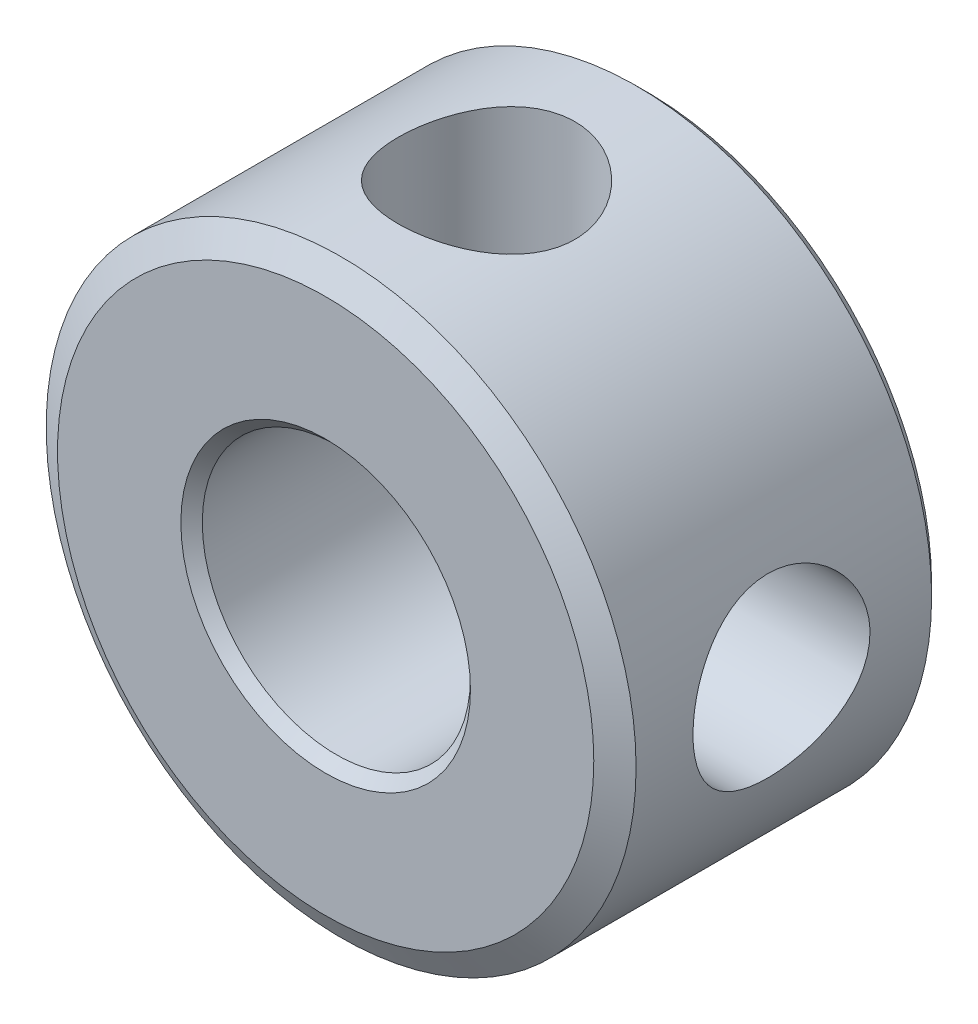
ISO-10303-21;
HEADER;
FILE_DESCRIPTION(('STEP AP214'),'2;1');
FILE_NAME('part.step','',(''),(''),'','','');
FILE_SCHEMA(('AUTOMOTIVE_DESIGN { 1 0 10303 214 1 1 1 1 }'));
ENDSEC;
DATA;
#1=APPLICATION_CONTEXT('core data for automotive mechanical design processes');
#2=APPLICATION_PROTOCOL_DEFINITION('international standard','automotive_design',2000,#1);
#3=PRODUCT_CONTEXT('',#1,'mechanical');
#4=PRODUCT('Part','Part','',(#3));
#5=PRODUCT_RELATED_PRODUCT_CATEGORY('part','',(#4));
#6=PRODUCT_DEFINITION_FORMATION('','',#4);
#7=PRODUCT_DEFINITION_CONTEXT('part definition',#1,'design');
#8=PRODUCT_DEFINITION('design','',#6,#7);
#9=PRODUCT_DEFINITION_SHAPE('','',#8);
#10=(LENGTH_UNIT() NAMED_UNIT(*) SI_UNIT(.MILLI.,.METRE.));
#11=(NAMED_UNIT(*) PLANE_ANGLE_UNIT() SI_UNIT($,.RADIAN.));
#12=(NAMED_UNIT(*) SI_UNIT($,.STERADIAN.) SOLID_ANGLE_UNIT());
#13=UNCERTAINTY_MEASURE_WITH_UNIT(LENGTH_MEASURE(1.E-05),#10,'distance_accuracy_value','');
#14=(GEOMETRIC_REPRESENTATION_CONTEXT(3) GLOBAL_UNCERTAINTY_ASSIGNED_CONTEXT((#13)) GLOBAL_UNIT_ASSIGNED_CONTEXT((#10,
#11,#12)) REPRESENTATION_CONTEXT('',''));
#15=CARTESIAN_POINT('',(0.,0.,0.));
#16=DIRECTION('',(0.,0.,1.));
#17=DIRECTION('',(1.,0.,0.));
#18=AXIS2_PLACEMENT_3D('',#15,#16,#17);
#19=CARTESIAN_POINT('',(0.,0.,0.));
#20=DIRECTION('',(0.,0.,1.));
#21=DIRECTION('',(1.,0.,0.));
#22=AXIS2_PLACEMENT_3D('',#19,#20,#21);
#23=CYLINDRICAL_SURFACE('',#22,5.5);
#24=CARTESIAN_POINT('',(0.,5.5,-1.35));
#25=CARTESIAN_POINT('',(-0.0905174740286299,5.49999922175605,-1.35000109723338));
#26=CARTESIAN_POINT('',(-0.181046050186682,5.49774407263349,-1.35747324998637));
#27=CARTESIAN_POINT('',(-0.359466937835369,5.4889681615306,-1.38709348964431));
#28=CARTESIAN_POINT('',(-0.447358454852562,5.48244612728661,-1.40924595382568));
#29=CARTESIAN_POINT('',(-0.617905978529979,5.4658510775202,-1.46742061860129));
#30=CARTESIAN_POINT('',(-0.70056950083491,5.45578330275468,-1.50342235658083));
#31=CARTESIAN_POINT('',(-0.858686599158444,5.4331432016141,-1.58818970236142));
#32=CARTESIAN_POINT('',(-0.934139214216635,5.42057054211273,-1.63695700813496));
#33=CARTESIAN_POINT('',(-1.07785897690212,5.39385810912051,-1.74734640821994));
#34=CARTESIAN_POINT('',(-1.14588987836877,5.3796862202274,-1.80926828847451));
#35=CARTESIAN_POINT('',(-1.27077413015656,5.35156417631486,-1.9435701529012));
#36=CARTESIAN_POINT('',(-1.32762559960185,5.33761405896951,-2.01595189333746));
#37=CARTESIAN_POINT('',(-1.42978041496078,5.31117525393149,-2.17111782834137));
#38=CARTESIAN_POINT('',(-1.47479539924435,5.29872647330262,-2.25409930708981));
#39=CARTESIAN_POINT('',(-1.55013534252236,5.27717982433434,-2.42688817965332));
#40=CARTESIAN_POINT('',(-1.5804638291197,5.26808115144642,-2.51669392832077));
#41=CARTESIAN_POINT('',(-1.62471797050917,5.25459957922278,-2.69792929274351));
#42=CARTESIAN_POINT('',(-1.63907915858145,5.25009176256987,-2.78924301825034));
#43=CARTESIAN_POINT('',(-1.65235103676139,5.24593068724744,-2.97308647183844));
#44=CARTESIAN_POINT('',(-1.65126547037186,5.24627625236628,-3.065615899865));
#45=CARTESIAN_POINT('',(-1.63401674919793,5.25167218474556,-3.24572229946933));
#46=CARTESIAN_POINT('',(-1.61839925788954,5.25655227459055,-3.33335747539846));
#47=CARTESIAN_POINT('',(-1.57341162469761,5.27019191851487,-3.50470176490081));
#48=CARTESIAN_POINT('',(-1.54404012555805,5.27895185545586,-3.58841049011177));
#49=CARTESIAN_POINT('',(-1.4719762931905,5.2995000638247,-3.75086038462681));
#50=CARTESIAN_POINT('',(-1.42910698628107,5.31132817727547,-3.82951779235079));
#51=CARTESIAN_POINT('',(-1.33138744847552,5.33666085700071,-3.97870522421121));
#52=CARTESIAN_POINT('',(-1.27653431402847,5.3501658292169,-4.04923327235516));
#53=CARTESIAN_POINT('',(-1.15369419842101,5.37802112427731,-4.18325480983822));
#54=CARTESIAN_POINT('',(-1.08525439821367,5.39238319741548,-4.24633153043264));
#55=CARTESIAN_POINT('',(-0.938589585245362,5.41983468469584,-4.36020938247067));
#56=CARTESIAN_POINT('',(-0.860363957046975,5.43292401870251,-4.41100974125587));
#57=CARTESIAN_POINT('',(-0.695590542177082,5.45647476076417,-4.4991459147112));
#58=CARTESIAN_POINT('',(-0.608990524722744,5.46691798035145,-4.53638926787485));
#59=CARTESIAN_POINT('',(-0.43036995716387,5.48386874015444,-4.59565954910959));
#60=CARTESIAN_POINT('',(-0.338350926748538,5.49037737805699,-4.61769072138574));
#61=CARTESIAN_POINT('',(-0.155047466935164,5.49855201107892,-4.64521739568933));
#62=CARTESIAN_POINT('',(-0.0638551073613046,5.50038335459569,-4.65127774438177));
#63=CARTESIAN_POINT('',(0.118249566405722,5.49948215565936,-4.64827392871671));
#64=CARTESIAN_POINT('',(0.20916191635986,5.49675022245532,-4.63921178338341));
#65=CARTESIAN_POINT('',(0.385993965840668,5.48713766685879,-4.60667692777735));
#66=CARTESIAN_POINT('',(0.471980049875587,5.48035212779358,-4.58353427366104));
#67=CARTESIAN_POINT('',(0.638830102849975,5.46341782625686,-4.52389244394398));
#68=CARTESIAN_POINT('',(0.719693454728143,5.45326865953193,-4.48739166285835));
#69=CARTESIAN_POINT('',(0.876080908407158,5.43036619786457,-4.40112151797076));
#70=CARTESIAN_POINT('',(0.951438208819637,5.41755808912642,-4.35106472495723));
#71=CARTESIAN_POINT('',(1.09287563877816,5.39080815640749,-4.23945277054191));
#72=CARTESIAN_POINT('',(1.15895343559153,5.37686604874188,-4.17789472692356));
#73=CARTESIAN_POINT('',(1.2824431900613,5.34878489056052,-4.04237396079372));
#74=CARTESIAN_POINT('',(1.33945329354654,5.33465707536594,-3.96804193665109));
#75=CARTESIAN_POINT('',(1.44021894579369,5.3083416676231,-3.81055926708511));
#76=CARTESIAN_POINT('',(1.48397484212419,5.29615402420116,-3.72740885298596));
#77=CARTESIAN_POINT('',(1.55669081839885,5.27523908576561,-3.55491425961984));
#78=CARTESIAN_POINT('',(1.58571981630755,5.2664957162821,-3.46560119480975));
#79=CARTESIAN_POINT('',(1.62823903896625,5.25350753799074,-3.28304323417537));
#80=CARTESIAN_POINT('',(1.64173458876657,5.2492611875913,-3.18979969713356));
#81=CARTESIAN_POINT('',(1.65244182933565,5.24589969745695,-3.00620232978615));
#82=CARTESIAN_POINT('',(1.65030860839339,5.2465781218703,-2.91588998388066));
#83=CARTESIAN_POINT('',(1.63138255989295,5.25249341417124,-2.73697448628992));
#84=CARTESIAN_POINT('',(1.61459031937188,5.25773009951806,-2.64837126630601));
#85=CARTESIAN_POINT('',(1.5672457768455,5.27203340037424,-2.47646006094286));
#86=CARTESIAN_POINT('',(1.53686693057775,5.28105165000561,-2.39309998390214));
#87=CARTESIAN_POINT('',(1.46334657833242,5.3018930680005,-2.2325933173005));
#88=CARTESIAN_POINT('',(1.42020262959164,5.31371677313743,-2.15544792059517));
#89=CARTESIAN_POINT('',(1.32053640185579,5.33937444068416,-2.00652057182018));
#90=CARTESIAN_POINT('',(1.26358403702293,5.35326594180177,-1.93503636261355));
#91=CARTESIAN_POINT('',(1.1386917809276,5.38121452495028,-1.80242725186135));
#92=CARTESIAN_POINT('',(1.07074903884795,5.39527164906296,-1.74130504658547));
#93=CARTESIAN_POINT('',(0.923412338401572,5.42246030227714,-1.62937424647547));
#94=CARTESIAN_POINT('',(0.843741674369667,5.43555275742241,-1.57891940845896));
#95=CARTESIAN_POINT('',(0.676655511381881,5.45886748501394,-1.49219131310557));
#96=CARTESIAN_POINT('',(0.589243658298849,5.46909109924173,-1.45591142289804));
#97=CARTESIAN_POINT('',(0.418833483920808,5.48462392466231,-1.40181519678198));
#98=CARTESIAN_POINT('',(0.336365658149657,5.49034230119174,-1.38243715982843));
#99=CARTESIAN_POINT('',(0.169268214753857,5.49803038943942,-1.35653012223427));
#100=CARTESIAN_POINT('',(0.0846389608439533,5.50000072770214,-1.3499989740247));
#101=CARTESIAN_POINT('',(0.,5.5,-1.35));
#102=B_SPLINE_CURVE_WITH_KNOTS('',3,(#24,#25,#26,#27,#28,#29,#30,#31,#32,#33,#34,#35,#36,#37,
#38,#39,#40,#41,#42,#43,#44,#45,#46,#47,#48,#49,#50,#51,#52,#53,#54,#55,#56,#57,#58,#59,#60,#61,
#62,#63,#64,#65,#66,#67,#68,#69,#70,#71,#72,#73,#74,#75,#76,#77,#78,#79,#80,#81,#82,#83,#84,#85,
#86,#87,#88,#89,#90,#91,#92,#93,#94,#95,#96,#97,#98,#99,#100,#101),.UNSPECIFIED.,.T.,.F.,(4,2,2,
2,2,2,2,2,2,2,2,2,2,2,2,2,2,2,2,2,2,2,2,2,2,2,2,2,2,2,2,2,2,2,2,2,2,2,4),(0.,0.271241523973871,
0.542563961330599,0.813487043930961,1.08444618085397,1.36241163243011,1.64042381017496,
1.9246862910452,2.20888045997546,2.48511658292259,2.76128576150998,3.02748618367444,
3.29371288023801,3.56358669091831,3.83352596174411,4.11473814452983,4.39596802184178,
4.67908151569857,4.96211598881688,5.23499690382399,5.50784138905359,5.77452421350559,
6.04123910053101,6.31412436273199,6.5870781020021,6.869944403551,7.15280328677948,
7.43432596446376,7.71575210406311,7.98545171013636,8.25514051627759,8.52148044442993,
8.78787137308417,9.06396618247923,9.34013272387252,9.62437295772337,9.90848002754758,
10.162148611235,10.4157747864376),.UNSPECIFIED.);
#103=CARTESIAN_POINT('',(0.,5.5,-1.35));
#104=VERTEX_POINT('',#103);
#105=EDGE_CURVE('E60',#104,#104,#102,.T.);
#106=ORIENTED_EDGE('',*,*,#105,.T.);
#107=EDGE_LOOP('',(#106));
#108=FACE_BOUND('',#107,.T.);
#109=CARTESIAN_POINT('',(5.5,0.,-1.35));
#110=CARTESIAN_POINT('',(5.49999922175605,0.0905174740286107,-1.35000109723338));
#111=CARTESIAN_POINT('',(5.49774407263349,0.181046050186663,-1.35747324998637));
#112=CARTESIAN_POINT('',(5.4889681615306,0.359466937835349,-1.38709348964431));
#113=CARTESIAN_POINT('',(5.48244612728661,0.447358454852542,-1.40924595382568));
#114=CARTESIAN_POINT('',(5.4658510775202,0.61790597852996,-1.46742061860129));
#115=CARTESIAN_POINT('',(5.45578330275468,0.700569500834891,-1.50342235658083));
#116=CARTESIAN_POINT('',(5.4331432016141,0.858686599158425,-1.58818970236142));
#117=CARTESIAN_POINT('',(5.42057054211274,0.934139214216617,-1.63695700813496));
#118=CARTESIAN_POINT('',(5.39385810912052,1.0778589769021,-1.74734640821994));
#119=CARTESIAN_POINT('',(5.3796862202274,1.14588987836875,-1.80926828847451));
#120=CARTESIAN_POINT('',(5.35156417631487,1.27077413015654,-1.9435701529012));
#121=CARTESIAN_POINT('',(5.33761405896952,1.32762559960183,-2.01595189333746));
#122=CARTESIAN_POINT('',(5.3111752539315,1.42978041496076,-2.17111782834137));
#123=CARTESIAN_POINT('',(5.29872647330263,1.47479539924433,-2.25409930708981));
#124=CARTESIAN_POINT('',(5.27717982433435,1.55013534252234,-2.42688817965332));
#125=CARTESIAN_POINT('',(5.26808115144642,1.58046382911969,-2.51669392832077));
#126=CARTESIAN_POINT('',(5.25459957922278,1.62471797050915,-2.69792929274351));
#127=CARTESIAN_POINT('',(5.25009176256987,1.63907915858143,-2.78924301825034));
#128=CARTESIAN_POINT('',(5.24593068724745,1.65235103676137,-2.97308647183844));
#129=CARTESIAN_POINT('',(5.24627625236629,1.65126547037184,-3.065615899865));
#130=CARTESIAN_POINT('',(5.25167218474556,1.63401674919791,-3.24572229946933));
#131=CARTESIAN_POINT('',(5.25655227459055,1.61839925788952,-3.33335747539846));
#132=CARTESIAN_POINT('',(5.27019191851487,1.57341162469759,-3.50470176490081));
#133=CARTESIAN_POINT('',(5.27895185545586,1.54404012555803,-3.58841049011177));
#134=CARTESIAN_POINT('',(5.29950006382471,1.47197629319048,-3.75086038462681));
#135=CARTESIAN_POINT('',(5.31132817727548,1.42910698628105,-3.82951779235079));
#136=CARTESIAN_POINT('',(5.33666085700071,1.3313874484755,-3.97870522421121));
#137=CARTESIAN_POINT('',(5.35016582921691,1.27653431402845,-4.04923327235516));
#138=CARTESIAN_POINT('',(5.37802112427731,1.15369419842099,-4.18325480983822));
#139=CARTESIAN_POINT('',(5.39238319741548,1.08525439821365,-4.24633153043264));
#140=CARTESIAN_POINT('',(5.41983468469585,0.938589585245343,-4.36020938247067));
#141=CARTESIAN_POINT('',(5.43292401870251,0.860363957046956,-4.41100974125587));
#142=CARTESIAN_POINT('',(5.45647476076418,0.695590542177063,-4.4991459147112));
#143=CARTESIAN_POINT('',(5.46691798035146,0.608990524722725,-4.53638926787485));
#144=CARTESIAN_POINT('',(5.48386874015444,0.430369957163851,-4.59565954910959));
#145=CARTESIAN_POINT('',(5.49037737805699,0.338350926748519,-4.61769072138574));
#146=CARTESIAN_POINT('',(5.49855201107892,0.155047466935144,-4.64521739568933));
#147=CARTESIAN_POINT('',(5.50038335459569,0.0638551073612853,-4.65127774438177));
#148=CARTESIAN_POINT('',(5.49948215565935,-0.118249566405742,-4.64827392871671));
#149=CARTESIAN_POINT('',(5.49675022245532,-0.209161916359879,-4.63921178338341));
#150=CARTESIAN_POINT('',(5.48713766685879,-0.385993965840687,-4.60667692777735));
#151=CARTESIAN_POINT('',(5.48035212779358,-0.471980049875606,-4.58353427366104));
#152=CARTESIAN_POINT('',(5.46341782625685,-0.638830102849994,-4.52389244394398));
#153=CARTESIAN_POINT('',(5.45326865953193,-0.719693454728162,-4.48739166285835));
#154=CARTESIAN_POINT('',(5.43036619786457,-0.876080908407177,-4.40112151797076));
#155=CARTESIAN_POINT('',(5.41755808912642,-0.951438208819656,-4.35106472495723));
#156=CARTESIAN_POINT('',(5.39080815640749,-1.09287563877818,-4.23945277054191));
#157=CARTESIAN_POINT('',(5.37686604874187,-1.15895343559155,-4.17789472692356));
#158=CARTESIAN_POINT('',(5.34878489056051,-1.28244319006131,-4.04237396079372));
#159=CARTESIAN_POINT('',(5.33465707536594,-1.33945329354656,-3.96804193665109));
#160=CARTESIAN_POINT('',(5.30834166762309,-1.44021894579371,-3.81055926708511));
#161=CARTESIAN_POINT('',(5.29615402420116,-1.48397484212421,-3.72740885298596));
#162=CARTESIAN_POINT('',(5.2752390857656,-1.55669081839887,-3.55491425961984));
#163=CARTESIAN_POINT('',(5.26649571628209,-1.58571981630756,-3.46560119480975));
#164=CARTESIAN_POINT('',(5.25350753799073,-1.62823903896627,-3.28304323417537));
#165=CARTESIAN_POINT('',(5.2492611875913,-1.64173458876659,-3.18979969713356));
#166=CARTESIAN_POINT('',(5.24589969745695,-1.65244182933567,-3.00620232978615));
#167=CARTESIAN_POINT('',(5.24657812187029,-1.65030860839341,-2.91588998388066));
#168=CARTESIAN_POINT('',(5.25249341417123,-1.63138255989296,-2.73697448628992));
#169=CARTESIAN_POINT('',(5.25773009951806,-1.61459031937189,-2.64837126630601));
#170=CARTESIAN_POINT('',(5.27203340037424,-1.56724577684551,-2.47646006094286));
#171=CARTESIAN_POINT('',(5.2810516500056,-1.53686693057777,-2.39309998390214));
#172=CARTESIAN_POINT('',(5.30189306800049,-1.46334657833244,-2.23259331730051));
#173=CARTESIAN_POINT('',(5.31371677313742,-1.42020262959166,-2.15544792059517));
#174=CARTESIAN_POINT('',(5.33937444068416,-1.32053640185581,-2.00652057182018));
#175=CARTESIAN_POINT('',(5.35326594180177,-1.26358403702295,-1.93503636261355));
#176=CARTESIAN_POINT('',(5.38121452495028,-1.13869178092762,-1.80242725186135));
#177=CARTESIAN_POINT('',(5.39527164906295,-1.07074903884797,-1.74130504658547));
#178=CARTESIAN_POINT('',(5.42246030227713,-0.923412338401591,-1.62937424647547));
#179=CARTESIAN_POINT('',(5.43555275742241,-0.843741674369686,-1.57891940845896));
#180=CARTESIAN_POINT('',(5.45886748501394,-0.6766555113819,-1.49219131310557));
#181=CARTESIAN_POINT('',(5.46909109924173,-0.589243658298868,-1.45591142289804));
#182=CARTESIAN_POINT('',(5.48462392466231,-0.418833483920828,-1.40181519678198));
#183=CARTESIAN_POINT('',(5.49034230119174,-0.336365658149676,-1.38243715982843));
#184=CARTESIAN_POINT('',(5.49803038943942,-0.169268214753876,-1.35653012223427));
#185=CARTESIAN_POINT('',(5.50000072770214,-0.0846389608439726,-1.3499989740247));
#186=CARTESIAN_POINT('',(5.5,0.,-1.35));
#187=B_SPLINE_CURVE_WITH_KNOTS('',3,(#109,#110,#111,#112,#113,#114,#115,#116,#117,#118,#119,
#120,#121,#122,#123,#124,#125,#126,#127,#128,#129,#130,#131,#132,#133,#134,#135,#136,#137,#138,
#139,#140,#141,#142,#143,#144,#145,#146,#147,#148,#149,#150,#151,#152,#153,#154,#155,#156,#157,
#158,#159,#160,#161,#162,#163,#164,#165,#166,#167,#168,#169,#170,#171,#172,#173,#174,#175,#176,
#177,#178,#179,#180,#181,#182,#183,#184,#185,#186),.UNSPECIFIED.,.T.,.F.,(4,2,2,2,2,2,2,2,2,2,2,
2,2,2,2,2,2,2,2,2,2,2,2,2,2,2,2,2,2,2,2,2,2,2,2,2,2,2,4),(0.,0.271241523973871,
0.542563961330599,0.813487043930961,1.08444618085397,1.36241163243011,1.64042381017496,
1.9246862910452,2.20888045997546,2.48511658292259,2.76128576150998,3.02748618367443,
3.29371288023801,3.56358669091831,3.83352596174411,4.11473814452983,4.39596802184178,
4.67908151569857,4.96211598881688,5.23499690382399,5.50784138905359,5.77452421350559,
6.04123910053101,6.31412436273199,6.5870781020021,6.869944403551,7.15280328677948,
7.43432596446376,7.71575210406311,7.98545171013637,8.25514051627759,8.52148044442993,
8.78787137308418,9.06396618247923,9.34013272387252,9.62437295772337,9.90848002754758,
10.1621486112351,10.4157747864376),.UNSPECIFIED.);
#188=CARTESIAN_POINT('',(5.5,0.,-1.35));
#189=VERTEX_POINT('',#188);
#190=EDGE_CURVE('E114',#189,#189,#187,.T.);
#191=ORIENTED_EDGE('',*,*,#190,.T.);
#192=EDGE_LOOP('',(#191));
#193=FACE_BOUND('',#192,.T.);
#194=CARTESIAN_POINT('',(0.,0.,-5.8));
#195=DIRECTION('',(0.,0.,1.));
#196=DIRECTION('',(1.,0.,0.));
#197=AXIS2_PLACEMENT_3D('',#194,#195,#196);
#198=CIRCLE('',#197,5.5);
#199=CARTESIAN_POINT('',(5.5,0.,-5.8));
#200=VERTEX_POINT('',#199);
#201=EDGE_CURVE('E11',#200,#200,#198,.T.);
#202=ORIENTED_EDGE('',*,*,#201,.T.);
#203=EDGE_LOOP('',(#202));
#204=FACE_BOUND('',#203,.T.);
#205=CARTESIAN_POINT('',(0.,0.,-0.288675134594819));
#206=DIRECTION('',(0.,0.,1.));
#207=DIRECTION('',(1.,0.,0.));
#208=AXIS2_PLACEMENT_3D('',#205,#206,#207);
#209=CIRCLE('',#208,5.5);
#210=CARTESIAN_POINT('',(5.5,0.,-0.288675134594819));
#211=VERTEX_POINT('',#210);
#212=EDGE_CURVE('E104',#211,#211,#209,.T.);
#213=ORIENTED_EDGE('',*,*,#212,.F.);
#214=EDGE_LOOP('',(#213));
#215=FACE_BOUND('',#214,.T.);
#216=ADVANCED_FACE('F34',(#108,#193,#204,#215),#23,.T.);
#217=CARTESIAN_POINT('',(0.,2.5,0.));
#218=DIRECTION('',(0.,0.,-1.));
#219=DIRECTION('',(-1.,0.,0.));
#220=AXIS2_PLACEMENT_3D('',#217,#218,#219);
#221=PLANE('',#220);
#222=CARTESIAN_POINT('',(0.,0.,0.));
#223=DIRECTION('',(0.,0.,-1.));
#224=DIRECTION('',(-1.,0.,0.));
#225=AXIS2_PLACEMENT_3D('',#222,#223,#224);
#226=CIRCLE('',#225,2.7);
#227=CARTESIAN_POINT('',(-2.7,0.,0.));
#228=VERTEX_POINT('',#227);
#229=EDGE_CURVE('E49',#228,#228,#226,.T.);
#230=ORIENTED_EDGE('',*,*,#229,.T.);
#231=EDGE_LOOP('',(#230));
#232=FACE_BOUND('',#231,.T.);
#233=CARTESIAN_POINT('',(0.,0.,0.));
#234=DIRECTION('',(0.,0.,1.));
#235=DIRECTION('',(1.,0.,0.));
#236=AXIS2_PLACEMENT_3D('',#233,#234,#235);
#237=CIRCLE('',#236,5.);
#238=CARTESIAN_POINT('',(5.,0.,0.));
#239=VERTEX_POINT('',#238);
#240=EDGE_CURVE('E102',#239,#239,#237,.T.);
#241=ORIENTED_EDGE('',*,*,#240,.T.);
#242=EDGE_LOOP('',(#241));
#243=FACE_BOUND('',#242,.T.);
#244=ADVANCED_FACE('F90',(#232,#243),#221,.F.);
#245=CARTESIAN_POINT('',(0.,5.5,-6.));
#246=DIRECTION('',(0.,0.,1.));
#247=DIRECTION('',(1.,0.,0.));
#248=AXIS2_PLACEMENT_3D('',#245,#246,#247);
#249=PLANE('',#248);
#250=CARTESIAN_POINT('',(0.,0.,-6.));
#251=DIRECTION('',(0.,0.,1.));
#252=DIRECTION('',(1.,0.,0.));
#253=AXIS2_PLACEMENT_3D('',#250,#251,#252);
#254=CIRCLE('',#253,2.7);
#255=CARTESIAN_POINT('',(2.7,0.,-6.));
#256=VERTEX_POINT('',#255);
#257=EDGE_CURVE('E41',#256,#256,#254,.T.);
#258=ORIENTED_EDGE('',*,*,#257,.T.);
#259=EDGE_LOOP('',(#258));
#260=FACE_BOUND('',#259,.T.);
#261=CARTESIAN_POINT('',(0.,0.,-6.));
#262=DIRECTION('',(0.,0.,1.));
#263=DIRECTION('',(1.,0.,0.));
#264=AXIS2_PLACEMENT_3D('',#261,#262,#263);
#265=CIRCLE('',#264,5.3);
#266=CARTESIAN_POINT('',(5.3,0.,-6.));
#267=VERTEX_POINT('',#266);
#268=EDGE_CURVE('E45',#267,#267,#265,.F.);
#269=ORIENTED_EDGE('',*,*,#268,.T.);
#270=EDGE_LOOP('',(#269));
#271=FACE_BOUND('',#270,.T.);
#272=ADVANCED_FACE('F88',(#260,#271),#249,.F.);
#273=CARTESIAN_POINT('',(0.,0.,0.));
#274=DIRECTION('',(0.,0.,1.));
#275=DIRECTION('',(1.,0.,0.));
#276=AXIS2_PLACEMENT_3D('',#273,#274,#275);
#277=CYLINDRICAL_SURFACE('',#276,2.5);
#278=CARTESIAN_POINT('',(0.,0.,-0.199999999999997));
#279=DIRECTION('',(0.,0.,-1.));
#280=DIRECTION('',(-1.,0.,0.));
#281=AXIS2_PLACEMENT_3D('',#278,#279,#280);
#282=CIRCLE('',#281,2.5);
#283=CARTESIAN_POINT('',(-2.5,0.,-0.199999999999997));
#284=VERTEX_POINT('',#283);
#285=EDGE_CURVE('E54',#284,#284,#282,.F.);
#286=ORIENTED_EDGE('',*,*,#285,.T.);
#287=EDGE_LOOP('',(#286));
#288=FACE_BOUND('',#287,.T.);
#289=CARTESIAN_POINT('',(0.,0.,-5.8));
#290=DIRECTION('',(0.,0.,1.));
#291=DIRECTION('',(1.,0.,0.));
#292=AXIS2_PLACEMENT_3D('',#289,#290,#291);
#293=CIRCLE('',#292,2.5);
#294=CARTESIAN_POINT('',(2.5,0.,-5.8));
#295=VERTEX_POINT('',#294);
#296=EDGE_CURVE('E57',#295,#295,#293,.F.);
#297=ORIENTED_EDGE('',*,*,#296,.T.);
#298=EDGE_LOOP('',(#297));
#299=FACE_BOUND('',#298,.T.);
#300=CARTESIAN_POINT('',(2.5,0.,-1.35));
#301=CARTESIAN_POINT('',(2.49999873549003,-0.0830573983732488,-1.35000126862804));
#302=CARTESIAN_POINT('',(2.49582409665183,-0.166127065031056,-1.35630667186413));
#303=CARTESIAN_POINT('',(2.47953793670965,-0.329627564785529,-1.38114411634922));
#304=CARTESIAN_POINT('',(2.46742152850525,-0.410056740989759,-1.39968368614457));
#305=CARTESIAN_POINT('',(2.43645078323808,-0.565666795275713,-1.44786271886989));
#306=CARTESIAN_POINT('',(2.41762810153112,-0.640870379585392,-1.47745006440811));
#307=CARTESIAN_POINT('',(2.37476519567406,-0.784950958130415,-1.54647306916536));
#308=CARTESIAN_POINT('',(2.35072429045789,-0.853827124859538,-1.5859100140243));
#309=CARTESIAN_POINT('',(2.29695661149613,-0.98983686604679,-1.67713047784551));
#310=CARTESIAN_POINT('',(2.26692168776846,-1.05633669830189,-1.72967343174109));
#311=CARTESIAN_POINT('',(2.20498845637973,-1.18018285126922,-1.84381047902175));
#312=CARTESIAN_POINT('',(2.17308755114354,-1.23751597614874,-1.90541737982211));
#313=CARTESIAN_POINT('',(2.10506784648214,-1.35043149195501,-2.04697460620523));
#314=CARTESIAN_POINT('',(2.06905676275692,-1.40438210241812,-2.12828866911283));
#315=CARTESIAN_POINT('',(2.00249251833604,-1.49776993203112,-2.30087916675757));
#316=CARTESIAN_POINT('',(1.97192996499628,-1.53723225426475,-2.39213801139541));
#317=CARTESIAN_POINT('',(1.92884004929684,-1.59072490572627,-2.55586439472365));
#318=CARTESIAN_POINT('',(1.91365570400324,-1.608795235838,-2.62630603083517));
#319=CARTESIAN_POINT('',(1.89085843424036,-1.63553399265366,-2.7700981488949));
#320=CARTESIAN_POINT('',(1.8832328549512,-1.64421813584105,-2.84344355449881));
#321=CARTESIAN_POINT('',(1.8767275127729,-1.65164261236612,-2.99132332582722));
#322=CARTESIAN_POINT('',(1.87788113567674,-1.65034498655431,-3.06586115347341));
#323=CARTESIAN_POINT('',(1.88881894231039,-1.63781110929922,-3.21347646171562));
#324=CARTESIAN_POINT('',(1.89861041595222,-1.62656646304848,-3.2865526554804));
#325=CARTESIAN_POINT('',(1.9247714625747,-1.59550624855211,-3.42636758871684));
#326=CARTESIAN_POINT('',(1.94086012047487,-1.5760542420062,-3.49324304013499));
#327=CARTESIAN_POINT('',(1.97777008130562,-1.52947910263704,-3.62284954109938));
#328=CARTESIAN_POINT('',(1.99859293733809,-1.5023534516817,-3.68557922184734));
#329=CARTESIAN_POINT('',(2.04767344699338,-1.43495559420541,-3.81854909322));
#330=CARTESIAN_POINT('',(2.07658411071836,-1.39313654723766,-3.88776228965197));
#331=CARTESIAN_POINT('',(2.13598181471749,-1.30024206663367,-4.0189919318167));
#332=CARTESIAN_POINT('',(2.16647075308913,-1.24915529331517,-4.08099940667233));
#333=CARTESIAN_POINT('',(2.23295257125342,-1.12681675112712,-4.20920418248633));
#334=CARTESIAN_POINT('',(2.2687791910501,-1.05357972912128,-4.27361436846183));
#335=CARTESIAN_POINT('',(2.33569104521111,-0.895485143886812,-4.38930624083507));
#336=CARTESIAN_POINT('',(2.36678089167,-0.8106390389862,-4.44060073114898));
#337=CARTESIAN_POINT('',(2.41553581634305,-0.648739426272093,-4.5192306298641));
#338=CARTESIAN_POINT('',(2.43463913774794,-0.573446407588028,-4.54929570380841));
#339=CARTESIAN_POINT('',(2.4660834146067,-0.417976051373894,-4.59825596853884));
#340=CARTESIAN_POINT('',(2.47843002823382,-0.337802863295302,-4.61716050638165));
#341=CARTESIAN_POINT('',(2.49526903279627,-0.174366759571431,-4.64285212544903));
#342=CARTESIAN_POINT('',(2.49972950264785,-0.0910926735099132,-4.64958996132531));
#343=CARTESIAN_POINT('',(2.50024632578378,0.075545477147358,-4.65037341496494));
#344=CARTESIAN_POINT('',(2.49630295692062,0.158909538677209,-4.64441945235176));
#345=CARTESIAN_POINT('',(2.48094276300905,0.317590995066718,-4.62100177024053));
#346=CARTESIAN_POINT('',(2.4700348147583,0.393076905917266,-4.60432124818648));
#347=CARTESIAN_POINT('',(2.44214181786327,0.539940099102297,-4.56103485655246));
#348=CARTESIAN_POINT('',(2.42515579316953,0.611316719406953,-4.53442739282274));
#349=CARTESIAN_POINT('',(2.38509288962557,0.753061900566418,-4.47031801304004));
#350=CARTESIAN_POINT('',(2.36169438729977,0.823069989043648,-4.43222519006879));
#351=CARTESIAN_POINT('',(2.31110387644411,0.955962444034773,-4.34717107768241));
#352=CARTESIAN_POINT('',(2.28390936814436,1.01884206641325,-4.30020393702919));
#353=CARTESIAN_POINT('',(2.22308599354602,1.14612838724311,-4.19038919580252));
#354=CARTESIAN_POINT('',(2.18911767364704,1.2092212610642,-4.12620583079496));
#355=CARTESIAN_POINT('',(2.12148327059168,1.32429793175258,-3.98833442779844));
#356=CARTESIAN_POINT('',(2.08781737346632,1.37627528682547,-3.91464091782976));
#357=CARTESIAN_POINT('',(2.02745905544661,1.46353640050703,-3.76629660058215));
#358=CARTESIAN_POINT('',(2.00040607756764,1.49996651133877,-3.69247045190523));
#359=CARTESIAN_POINT('',(1.9524785912542,1.56184713022857,-3.53850368095121));
#360=CARTESIAN_POINT('',(1.93159294745004,1.58731746510717,-3.45837477408289));
#361=CARTESIAN_POINT('',(1.90193273164489,1.62268199450879,-3.30720143813099));
#362=CARTESIAN_POINT('',(1.89171317806774,1.63447382745327,-3.23689166756184));
#363=CARTESIAN_POINT('',(1.87921870273532,1.64882828119084,-3.09466117063124));
#364=CARTESIAN_POINT('',(1.87693616297071,1.65139975183535,-3.02274205571288));
#365=CARTESIAN_POINT('',(1.88066605675987,1.64714925615307,-2.87940886636248));
#366=CARTESIAN_POINT('',(1.88667877903556,1.64032696287033,-2.80799480959627));
#367=CARTESIAN_POINT('',(1.90607790977935,1.61773943894528,-2.6675975654752));
#368=CARTESIAN_POINT('',(1.9194740491083,1.60196240572202,-2.59861771417342));
#369=CARTESIAN_POINT('',(1.95644518519265,1.55672361400764,-2.44582920234826));
#370=CARTESIAN_POINT('',(1.98181441881502,1.52467713481425,-2.36322763672658));
#371=CARTESIAN_POINT('',(2.03791662644482,1.44883296418162,-2.20560579032337));
#372=CARTESIAN_POINT('',(2.06865703170771,1.40501894611546,-2.13059624353238));
#373=CARTESIAN_POINT('',(2.13264932094016,1.30588975445997,-1.98765562037985));
#374=CARTESIAN_POINT('',(2.1659352858846,1.25038987560408,-1.91986833701195));
#375=CARTESIAN_POINT('',(2.23156562575566,1.12910287160239,-1.79364652939387));
#376=CARTESIAN_POINT('',(2.2639097276649,1.06331279816865,-1.7352146953535));
#377=CARTESIAN_POINT('',(2.328844852877,0.913224109526739,-1.62216828986124));
#378=CARTESIAN_POINT('',(2.36095353516903,0.827637911480478,-1.56896225910042));
#379=CARTESIAN_POINT('',(2.41693780003557,0.646049497163123,-1.47837020056571));
#380=CARTESIAN_POINT('',(2.44082871479073,0.550067122404135,-1.44095468193369));
#381=CARTESIAN_POINT('',(2.47235569176035,0.378029135762691,-1.39211907554238));
#382=CARTESIAN_POINT('',(2.48264654834952,0.303664744230137,-1.37639461398933));
#383=CARTESIAN_POINT('',(2.49646746879981,0.152869610757753,-1.35533728302521));
#384=CARTESIAN_POINT('',(2.50000116376319,0.0764400010130702,-1.34999883244683));
#385=CARTESIAN_POINT('',(2.5,0.,-1.35));
#386=B_SPLINE_CURVE_WITH_KNOTS('',3,(#300,#301,#302,#303,#304,#305,#306,#307,#308,#309,#310,
#311,#312,#313,#314,#315,#316,#317,#318,#319,#320,#321,#322,#323,#324,#325,#326,#327,#328,#329,
#330,#331,#332,#333,#334,#335,#336,#337,#338,#339,#340,#341,#342,#343,#344,#345,#346,#347,#348,
#349,#350,#351,#352,#353,#354,#355,#356,#357,#358,#359,#360,#361,#362,#363,#364,#365,#366,#367,
#368,#369,#370,#371,#372,#373,#374,#375,#376,#377,#378,#379,#380,#381,#382,#383,#384,#385),
.UNSPECIFIED.,.T.,.F.,(4,2,2,2,2,2,2,2,2,2,2,2,2,2,2,2,2,2,2,2,2,2,2,2,2,2,2,2,2,2,2,2,2,2,2,2,
2,2,2,2,2,2,4),(0.,0.248863173219164,0.497879632505738,0.745735911637783,0.993624559661681,
1.26236142699035,1.53148173454875,1.84208059721148,2.15213873331274,2.37412103166174,
2.59573105830194,2.81818424963007,3.0408253600701,3.25449658913793,3.4682380166321,
3.72496879793679,3.98201585159,4.29224112966059,4.60216239062961,4.8509948640788,
5.09961864119514,5.34924649914315,5.5988661038809,5.83205917661709,6.06528971354039,
6.31352952087294,6.5619335787085,6.84938688817398,7.13700633715916,7.39601090345959,
7.65454492637288,7.86965548867985,8.08455952907284,8.29947104952727,8.51466648895039,
8.78967221613734,9.06506148314461,9.34518323893305,9.62538540113006,9.94089155188799,
10.2558058174589,10.484964597082,10.7140001987933),.UNSPECIFIED.);
#387=CARTESIAN_POINT('',(2.5,0.,-1.35));
#388=VERTEX_POINT('',#387);
#389=EDGE_CURVE('E107',#388,#388,#386,.T.);
#390=ORIENTED_EDGE('',*,*,#389,.T.);
#391=EDGE_LOOP('',(#390));
#392=FACE_BOUND('',#391,.T.);
#393=CARTESIAN_POINT('',(0.,2.5,-1.35));
#394=CARTESIAN_POINT('',(0.0830573983732402,2.49999873549003,-1.35000126862804));
#395=CARTESIAN_POINT('',(0.166127065031047,2.49582409665183,-1.35630667186413));
#396=CARTESIAN_POINT('',(0.32962756478552,2.47953793670965,-1.38114411634922));
#397=CARTESIAN_POINT('',(0.41005674098975,2.46742152850525,-1.39968368614457));
#398=CARTESIAN_POINT('',(0.565666795275704,2.43645078323809,-1.44786271886989));
#399=CARTESIAN_POINT('',(0.640870379585384,2.41762810153113,-1.47745006440811));
#400=CARTESIAN_POINT('',(0.784950958130407,2.37476519567406,-1.54647306916536));
#401=CARTESIAN_POINT('',(0.85382712485953,2.3507242904579,-1.5859100140243));
#402=CARTESIAN_POINT('',(0.989836866046782,2.29695661149613,-1.67713047784551));
#403=CARTESIAN_POINT('',(1.05633669830188,2.26692168776846,-1.72967343174109));
#404=CARTESIAN_POINT('',(1.18018285126921,2.20498845637974,-1.84381047902175));
#405=CARTESIAN_POINT('',(1.23751597614874,2.17308755114355,-1.90541737982211));
#406=CARTESIAN_POINT('',(1.350431491955,2.10506784648215,-2.04697460620523));
#407=CARTESIAN_POINT('',(1.40438210241811,2.06905676275693,-2.12828866911283));
#408=CARTESIAN_POINT('',(1.49776993203112,2.00249251833605,-2.30087916675757));
#409=CARTESIAN_POINT('',(1.53723225426474,1.97192996499629,-2.39213801139541));
#410=CARTESIAN_POINT('',(1.59072490572626,1.92884004929684,-2.55586439472365));
#411=CARTESIAN_POINT('',(1.608795235838,1.91365570400325,-2.62630603083517));
#412=CARTESIAN_POINT('',(1.63553399265365,1.89085843424036,-2.7700981488949));
#413=CARTESIAN_POINT('',(1.64421813584105,1.88323285495121,-2.84344355449881));
#414=CARTESIAN_POINT('',(1.65164261236611,1.87672751277291,-2.99132332582722));
#415=CARTESIAN_POINT('',(1.6503449865543,1.87788113567674,-3.06586115347341));
#416=CARTESIAN_POINT('',(1.63781110929921,1.8888189423104,-3.21347646171562));
#417=CARTESIAN_POINT('',(1.62656646304847,1.89861041595223,-3.2865526554804));
#418=CARTESIAN_POINT('',(1.5955062485521,1.92477146257471,-3.42636758871684));
#419=CARTESIAN_POINT('',(1.5760542420062,1.94086012047488,-3.49324304013499));
#420=CARTESIAN_POINT('',(1.52947910263704,1.97777008130563,-3.62284954109938));
#421=CARTESIAN_POINT('',(1.5023534516817,1.99859293733809,-3.68557922184734));
#422=CARTESIAN_POINT('',(1.43495559420541,2.04767344699338,-3.81854909322));
#423=CARTESIAN_POINT('',(1.39313654723765,2.07658411071837,-3.88776228965197));
#424=CARTESIAN_POINT('',(1.30024206663367,2.13598181471749,-4.0189919318167));
#425=CARTESIAN_POINT('',(1.24915529331516,2.16647075308913,-4.08099940667233));
#426=CARTESIAN_POINT('',(1.12681675112711,2.23295257125343,-4.20920418248633));
#427=CARTESIAN_POINT('',(1.05357972912128,2.26877919105011,-4.27361436846183));
#428=CARTESIAN_POINT('',(0.895485143886804,2.33569104521111,-4.38930624083507));
#429=CARTESIAN_POINT('',(0.810639038986192,2.36678089167,-4.44060073114898));
#430=CARTESIAN_POINT('',(0.648739426272085,2.41553581634305,-4.5192306298641));
#431=CARTESIAN_POINT('',(0.57344640758802,2.43463913774794,-4.54929570380841));
#432=CARTESIAN_POINT('',(0.417976051373885,2.4660834146067,-4.59825596853884));
#433=CARTESIAN_POINT('',(0.337802863295294,2.47843002823382,-4.61716050638165));
#434=CARTESIAN_POINT('',(0.174366759571422,2.49526903279627,-4.64285212544903));
#435=CARTESIAN_POINT('',(0.0910926735099045,2.49972950264785,-4.64958996132531));
#436=CARTESIAN_POINT('',(-0.0755454771473667,2.50024632578377,-4.65037341496494));
#437=CARTESIAN_POINT('',(-0.158909538677218,2.49630295692062,-4.64441945235176));
#438=CARTESIAN_POINT('',(-0.317590995066726,2.48094276300905,-4.62100177024053));
#439=CARTESIAN_POINT('',(-0.393076905917275,2.4700348147583,-4.60432124818648));
#440=CARTESIAN_POINT('',(-0.539940099102305,2.44214181786327,-4.56103485655246));
#441=CARTESIAN_POINT('',(-0.611316719406961,2.42515579316953,-4.53442739282274));
#442=CARTESIAN_POINT('',(-0.753061900566426,2.38509288962557,-4.47031801304004));
#443=CARTESIAN_POINT('',(-0.823069989043656,2.36169438729977,-4.43222519006879));
#444=CARTESIAN_POINT('',(-0.955962444034781,2.31110387644411,-4.34717107768241));
#445=CARTESIAN_POINT('',(-1.01884206641326,2.28390936814435,-4.30020393702919));
#446=CARTESIAN_POINT('',(-1.14612838724312,2.22308599354602,-4.19038919580252));
#447=CARTESIAN_POINT('',(-1.20922126106421,2.18911767364703,-4.12620583079496));
#448=CARTESIAN_POINT('',(-1.32429793175259,2.12148327059167,-3.98833442779844));
#449=CARTESIAN_POINT('',(-1.37627528682548,2.08781737346631,-3.91464091782976));
#450=CARTESIAN_POINT('',(-1.46353640050704,2.0274590554466,-3.76629660058215));
#451=CARTESIAN_POINT('',(-1.49996651133877,2.00040607756764,-3.69247045190523));
#452=CARTESIAN_POINT('',(-1.56184713022858,1.95247859125419,-3.53850368095121));
#453=CARTESIAN_POINT('',(-1.58731746510718,1.93159294745003,-3.45837477408289));
#454=CARTESIAN_POINT('',(-1.6226819945088,1.90193273164488,-3.30720143813099));
#455=CARTESIAN_POINT('',(-1.63447382745328,1.89171317806773,-3.23689166756184));
#456=CARTESIAN_POINT('',(-1.64882828119084,1.87921870273532,-3.09466117063124));
#457=CARTESIAN_POINT('',(-1.65139975183536,1.8769361629707,-3.02274205571288));
#458=CARTESIAN_POINT('',(-1.64714925615308,1.88066605675987,-2.87940886636248));
#459=CARTESIAN_POINT('',(-1.64032696287034,1.88667877903555,-2.80799480959627));
#460=CARTESIAN_POINT('',(-1.61773943894529,1.90607790977934,-2.6675975654752));
#461=CARTESIAN_POINT('',(-1.60196240572203,1.91947404910829,-2.59861771417342));
#462=CARTESIAN_POINT('',(-1.55672361400764,1.95644518519264,-2.44582920234826));
#463=CARTESIAN_POINT('',(-1.52467713481425,1.98181441881501,-2.36322763672658));
#464=CARTESIAN_POINT('',(-1.44883296418163,2.03791662644481,-2.20560579032337));
#465=CARTESIAN_POINT('',(-1.40501894611546,2.06865703170771,-2.13059624353238));
#466=CARTESIAN_POINT('',(-1.30588975445998,2.13264932094016,-1.98765562037985));
#467=CARTESIAN_POINT('',(-1.25038987560408,2.1659352858846,-1.91986833701195));
#468=CARTESIAN_POINT('',(-1.1291028716024,2.23156562575566,-1.79364652939387));
#469=CARTESIAN_POINT('',(-1.06331279816866,2.26390972766489,-1.7352146953535));
#470=CARTESIAN_POINT('',(-0.913224109526747,2.328844852877,-1.62216828986124));
#471=CARTESIAN_POINT('',(-0.827637911480486,2.36095353516902,-1.56896225910042));
#472=CARTESIAN_POINT('',(-0.646049497163132,2.41693780003556,-1.47837020056571));
#473=CARTESIAN_POINT('',(-0.550067122404143,2.44082871479072,-1.44095468193369));
#474=CARTESIAN_POINT('',(-0.3780291357627,2.47235569176035,-1.39211907554238));
#475=CARTESIAN_POINT('',(-0.303664744230145,2.48264654834952,-1.37639461398933));
#476=CARTESIAN_POINT('',(-0.152869610757762,2.49646746879981,-1.35533728302521));
#477=CARTESIAN_POINT('',(-0.0764400010130789,2.50000116376319,-1.34999883244683));
#478=CARTESIAN_POINT('',(0.,2.5,-1.35));
#479=B_SPLINE_CURVE_WITH_KNOTS('',3,(#393,#394,#395,#396,#397,#398,#399,#400,#401,#402,#403,
#404,#405,#406,#407,#408,#409,#410,#411,#412,#413,#414,#415,#416,#417,#418,#419,#420,#421,#422,
#423,#424,#425,#426,#427,#428,#429,#430,#431,#432,#433,#434,#435,#436,#437,#438,#439,#440,#441,
#442,#443,#444,#445,#446,#447,#448,#449,#450,#451,#452,#453,#454,#455,#456,#457,#458,#459,#460,
#461,#462,#463,#464,#465,#466,#467,#468,#469,#470,#471,#472,#473,#474,#475,#476,#477,#478),
.UNSPECIFIED.,.T.,.F.,(4,2,2,2,2,2,2,2,2,2,2,2,2,2,2,2,2,2,2,2,2,2,2,2,2,2,2,2,2,2,2,2,2,2,2,2,
2,2,2,2,2,2,4),(0.,0.248863173219164,0.497879632505738,0.745735911637783,0.993624559661681,
1.26236142699035,1.53148173454875,1.84208059721148,2.15213873331274,2.37412103166174,
2.59573105830194,2.81818424963007,3.0408253600701,3.25449658913793,3.4682380166321,
3.72496879793679,3.98201585159,4.29224112966059,4.60216239062961,4.8509948640788,
5.09961864119514,5.34924649914315,5.5988661038809,5.83205917661709,6.06528971354039,
6.31352952087294,6.5619335787085,6.84938688817398,7.13700633715916,7.39601090345959,
7.65454492637288,7.86965548867985,8.08455952907284,8.29947104952727,8.51466648895039,
8.78967221613734,9.06506148314461,9.34518323893305,9.62538540113006,9.94089155188799,
10.2558058174589,10.484964597082,10.7140001987933),.UNSPECIFIED.);
#480=CARTESIAN_POINT('',(0.,2.5,-1.35));
#481=VERTEX_POINT('',#480);
#482=EDGE_CURVE('E67',#481,#481,#479,.T.);
#483=ORIENTED_EDGE('',*,*,#482,.T.);
#484=EDGE_LOOP('',(#483));
#485=FACE_BOUND('',#484,.T.);
#486=ADVANCED_FACE('F80',(#288,#299,#392,#485),#277,.F.);
#487=CARTESIAN_POINT('',(0.,5.5,-3.));
#488=DIRECTION('',(0.,1.,0.));
#489=DIRECTION('',(0.,0.,1.));
#490=AXIS2_PLACEMENT_3D('',#487,#488,#489);
#491=CYLINDRICAL_SURFACE('',#490,1.65);
#492=ORIENTED_EDGE('',*,*,#482,.F.);
#493=EDGE_LOOP('',(#492));
#494=FACE_BOUND('',#493,.T.);
#495=ORIENTED_EDGE('',*,*,#105,.F.);
#496=EDGE_LOOP('',(#495));
#497=FACE_BOUND('',#496,.T.);
#498=ADVANCED_FACE('F75',(#494,#497),#491,.F.);
#499=CARTESIAN_POINT('',(5.5,0.,-3.));
#500=DIRECTION('',(1.,0.,0.));
#501=DIRECTION('',(0.,0.,1.));
#502=AXIS2_PLACEMENT_3D('',#499,#500,#501);
#503=CYLINDRICAL_SURFACE('',#502,1.65);
#504=ORIENTED_EDGE('',*,*,#389,.F.);
#505=EDGE_LOOP('',(#504));
#506=FACE_BOUND('',#505,.T.);
#507=ORIENTED_EDGE('',*,*,#190,.F.);
#508=EDGE_LOOP('',(#507));
#509=FACE_BOUND('',#508,.T.);
#510=ADVANCED_FACE('F79',(#506,#509),#503,.F.);
#511=CARTESIAN_POINT('',(0.,0.,-0.199999999999997));
#512=DIRECTION('',(0.,0.,1.));
#513=DIRECTION('',(1.,0.,0.));
#514=AXIS2_PLACEMENT_3D('',#511,#512,#513);
#515=CONICAL_SURFACE('',#514,2.5,0.785398163397453);
#516=ORIENTED_EDGE('',*,*,#229,.F.);
#517=EDGE_LOOP('',(#516));
#518=FACE_BOUND('',#517,.T.);
#519=ORIENTED_EDGE('',*,*,#285,.F.);
#520=EDGE_LOOP('',(#519));
#521=FACE_BOUND('',#520,.T.);
#522=ADVANCED_FACE('F121',(#518,#521),#515,.F.);
#523=CARTESIAN_POINT('',(0.,0.,-6.));
#524=DIRECTION('',(0.,0.,-1.));
#525=DIRECTION('',(-1.,0.,0.));
#526=AXIS2_PLACEMENT_3D('',#523,#524,#525);
#527=CONICAL_SURFACE('',#526,2.7,0.785398163397443);
#528=ORIENTED_EDGE('',*,*,#296,.F.);
#529=EDGE_LOOP('',(#528));
#530=FACE_BOUND('',#529,.T.);
#531=ORIENTED_EDGE('',*,*,#257,.F.);
#532=EDGE_LOOP('',(#531));
#533=FACE_BOUND('',#532,.T.);
#534=ADVANCED_FACE('F130',(#530,#533),#527,.F.);
#535=CARTESIAN_POINT('',(0.,0.,-5.8));
#536=DIRECTION('',(0.,0.,1.));
#537=DIRECTION('',(1.,0.,0.));
#538=AXIS2_PLACEMENT_3D('',#535,#536,#537);
#539=CONICAL_SURFACE('',#538,5.5,0.785398163397453);
#540=ORIENTED_EDGE('',*,*,#268,.F.);
#541=EDGE_LOOP('',(#540));
#542=FACE_BOUND('',#541,.T.);
#543=ORIENTED_EDGE('',*,*,#201,.F.);
#544=EDGE_LOOP('',(#543));
#545=FACE_BOUND('',#544,.T.);
#546=ADVANCED_FACE('F36',(#542,#545),#539,.T.);
#547=CARTESIAN_POINT('',(0.,0.,0.));
#548=DIRECTION('',(0.,0.,-1.));
#549=DIRECTION('',(-1.,0.,0.));
#550=AXIS2_PLACEMENT_3D('',#547,#548,#549);
#551=CONICAL_SURFACE('',#550,5.,1.04719755119659);
#552=ORIENTED_EDGE('',*,*,#212,.T.);
#553=EDGE_LOOP('',(#552));
#554=FACE_BOUND('',#553,.T.);
#555=ORIENTED_EDGE('',*,*,#240,.F.);
#556=EDGE_LOOP('',(#555));
#557=FACE_BOUND('',#556,.T.);
#558=ADVANCED_FACE('F123',(#554,#557),#551,.T.);
#559=CLOSED_SHELL('',(#216,#244,#272,#486,#498,#510,#522,#534,#546,#558));
#560=MANIFOLD_SOLID_BREP('B2',#559);
#561=ADVANCED_BREP_SHAPE_REPRESENTATION('',(#18,#560),#14);
#562=SHAPE_DEFINITION_REPRESENTATION(#9,#561);
ENDSEC;
END-ISO-10303-21;
